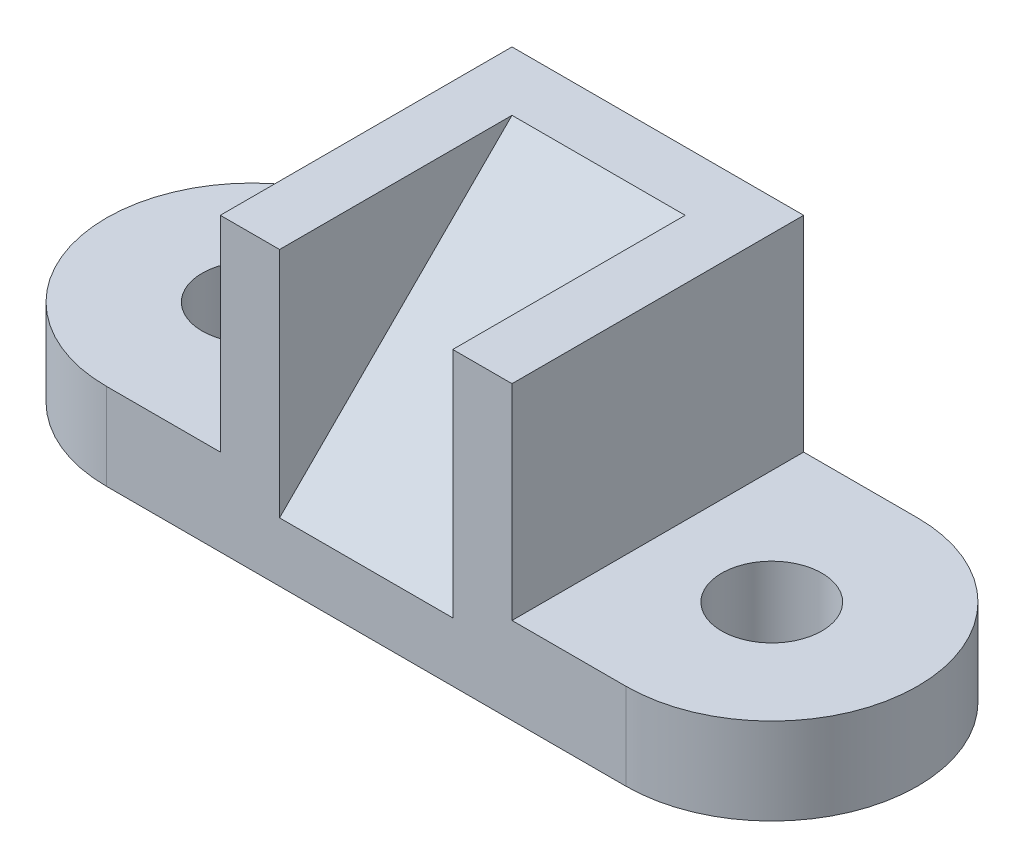
ISO-10303-21;
HEADER;
FILE_DESCRIPTION(('STEP AP214'),'2;1');
FILE_NAME('part.step','',(''),(''),'','','');
FILE_SCHEMA(('AUTOMOTIVE_DESIGN { 1 0 10303 214 1 1 1 1 }'));
ENDSEC;
DATA;
#1=APPLICATION_CONTEXT('core data for automotive mechanical design processes');
#2=APPLICATION_PROTOCOL_DEFINITION('international standard','automotive_design',2000,#1);
#3=PRODUCT_CONTEXT('',#1,'mechanical');
#4=PRODUCT('Part','Part','',(#3));
#5=PRODUCT_RELATED_PRODUCT_CATEGORY('part','',(#4));
#6=PRODUCT_DEFINITION_FORMATION('','',#4);
#7=PRODUCT_DEFINITION_CONTEXT('part definition',#1,'design');
#8=PRODUCT_DEFINITION('design','',#6,#7);
#9=PRODUCT_DEFINITION_SHAPE('','',#8);
#10=(LENGTH_UNIT() NAMED_UNIT(*) SI_UNIT(.MILLI.,.METRE.));
#11=(NAMED_UNIT(*) PLANE_ANGLE_UNIT() SI_UNIT($,.RADIAN.));
#12=(NAMED_UNIT(*) SI_UNIT($,.STERADIAN.) SOLID_ANGLE_UNIT());
#13=UNCERTAINTY_MEASURE_WITH_UNIT(LENGTH_MEASURE(1.E-05),#10,'distance_accuracy_value','');
#14=(GEOMETRIC_REPRESENTATION_CONTEXT(3) GLOBAL_UNCERTAINTY_ASSIGNED_CONTEXT((#13)) GLOBAL_UNIT_ASSIGNED_CONTEXT((#10,
#11,#12)) REPRESENTATION_CONTEXT('',''));
#15=CARTESIAN_POINT('',(0.,0.,0.));
#16=DIRECTION('',(0.,0.,1.));
#17=DIRECTION('',(1.,0.,0.));
#18=AXIS2_PLACEMENT_3D('',#15,#16,#17);
#19=CARTESIAN_POINT('',(0.,19.,0.));
#20=DIRECTION('',(0.,0.,-1.));
#21=DIRECTION('',(-1.,0.,0.));
#22=AXIS2_PLACEMENT_3D('',#19,#20,#21);
#23=PLANE('',#22);
#24=DIRECTION('',(0.,-1.,0.));
#25=VECTOR('',#24,1.);
#26=CARTESIAN_POINT('',(19.,0.,0.));
#27=LINE('',#26,#25);
#28=CARTESIAN_POINT('',(19.,64.,0.));
#29=VERTEX_POINT('',#28);
#30=CARTESIAN_POINT('',(19.,13.,0.));
#31=VERTEX_POINT('',#30);
#32=EDGE_CURVE('E124',#29,#31,#27,.T.);
#33=ORIENTED_EDGE('',*,*,#32,.T.);
#34=DIRECTION('',(1.,0.,0.));
#35=VECTOR('',#34,1.);
#36=CARTESIAN_POINT('',(-19.,13.,0.));
#37=LINE('',#36,#35);
#38=CARTESIAN_POINT('',(-19.,13.,0.));
#39=VERTEX_POINT('',#38);
#40=EDGE_CURVE('E182',#39,#31,#37,.T.);
#41=ORIENTED_EDGE('',*,*,#40,.F.);
#42=DIRECTION('',(0.,-1.,0.));
#43=VECTOR('',#42,1.);
#44=CARTESIAN_POINT('',(-19.,0.,0.));
#45=LINE('',#44,#43);
#46=CARTESIAN_POINT('',(-19.,64.,0.));
#47=VERTEX_POINT('',#46);
#48=EDGE_CURVE('E177',#47,#39,#45,.T.);
#49=ORIENTED_EDGE('',*,*,#48,.F.);
#50=DIRECTION('',(1.,0.,0.));
#51=VECTOR('',#50,1.);
#52=CARTESIAN_POINT('',(0.,64.,0.));
#53=LINE('',#52,#51);
#54=CARTESIAN_POINT('',(-32.,64.,0.));
#55=VERTEX_POINT('',#54);
#56=EDGE_CURVE('E191',#55,#47,#53,.T.);
#57=ORIENTED_EDGE('',*,*,#56,.F.);
#58=DIRECTION('',(0.,-1.,0.));
#59=VECTOR('',#58,1.);
#60=CARTESIAN_POINT('',(-32.,64.,0.));
#61=LINE('',#60,#59);
#62=CARTESIAN_POINT('',(-32.,19.,0.));
#63=VERTEX_POINT('',#62);
#64=EDGE_CURVE('E194',#55,#63,#61,.T.);
#65=ORIENTED_EDGE('',*,*,#64,.T.);
#66=DIRECTION('',(1.,0.,0.));
#67=VECTOR('',#66,1.);
#68=CARTESIAN_POINT('',(0.,19.,0.));
#69=LINE('',#68,#67);
#70=CARTESIAN_POINT('',(-57.,19.,0.));
#71=VERTEX_POINT('',#70);
#72=EDGE_CURVE('E214',#71,#63,#69,.T.);
#73=ORIENTED_EDGE('',*,*,#72,.F.);
#74=DIRECTION('',(0.,-1.,0.));
#75=VECTOR('',#74,1.);
#76=CARTESIAN_POINT('',(-57.,19.,0.));
#77=LINE('',#76,#75);
#78=CARTESIAN_POINT('',(-57.,0.,0.));
#79=VERTEX_POINT('',#78);
#80=EDGE_CURVE('E47',#71,#79,#77,.T.);
#81=ORIENTED_EDGE('',*,*,#80,.T.);
#82=DIRECTION('',(1.,0.,0.));
#83=VECTOR('',#82,1.);
#84=CARTESIAN_POINT('',(0.,0.,0.));
#85=LINE('',#84,#83);
#86=CARTESIAN_POINT('',(57.,0.,0.));
#87=VERTEX_POINT('',#86);
#88=EDGE_CURVE('E212',#79,#87,#85,.T.);
#89=ORIENTED_EDGE('',*,*,#88,.T.);
#90=DIRECTION('',(0.,-1.,0.));
#91=VECTOR('',#90,1.);
#92=CARTESIAN_POINT('',(57.,19.,0.));
#93=LINE('',#92,#91);
#94=CARTESIAN_POINT('',(57.,19.,0.));
#95=VERTEX_POINT('',#94);
#96=EDGE_CURVE('E174',#95,#87,#93,.T.);
#97=ORIENTED_EDGE('',*,*,#96,.F.);
#98=DIRECTION('',(-1.,0.,0.));
#99=VECTOR('',#98,1.);
#100=CARTESIAN_POINT('',(0.,19.,0.));
#101=LINE('',#100,#99);
#102=CARTESIAN_POINT('',(32.,19.,0.));
#103=VERTEX_POINT('',#102);
#104=EDGE_CURVE('E162',#95,#103,#101,.T.);
#105=ORIENTED_EDGE('',*,*,#104,.T.);
#106=DIRECTION('',(0.,-1.,0.));
#107=VECTOR('',#106,1.);
#108=CARTESIAN_POINT('',(32.,64.,0.));
#109=LINE('',#108,#107);
#110=CARTESIAN_POINT('',(32.,64.,0.));
#111=VERTEX_POINT('',#110);
#112=EDGE_CURVE('E144',#111,#103,#109,.T.);
#113=ORIENTED_EDGE('',*,*,#112,.F.);
#114=DIRECTION('',(-1.,0.,0.));
#115=VECTOR('',#114,1.);
#116=CARTESIAN_POINT('',(0.,64.,0.));
#117=LINE('',#116,#115);
#118=EDGE_CURVE('E138',#111,#29,#117,.T.);
#119=ORIENTED_EDGE('',*,*,#118,.T.);
#120=EDGE_LOOP('',(#33,#41,#49,#57,#65,#73,#81,#89,#97,#105,#113,#119));
#121=FACE_BOUND('',#120,.T.);
#122=ADVANCED_FACE('F39',(#121),#23,.F.);
#123=CARTESIAN_POINT('',(0.,64.,0.));
#124=DIRECTION('',(0.,-1.,0.));
#125=DIRECTION('',(0.,0.,-1.));
#126=AXIS2_PLACEMENT_3D('',#123,#124,#125);
#127=PLANE('',#126);
#128=DIRECTION('',(1.,0.,0.));
#129=VECTOR('',#128,1.);
#130=CARTESIAN_POINT('',(-19.,64.,-51.));
#131=LINE('',#130,#129);
#132=CARTESIAN_POINT('',(-19.,64.,-51.));
#133=VERTEX_POINT('',#132);
#134=CARTESIAN_POINT('',(19.,64.,-51.));
#135=VERTEX_POINT('',#134);
#136=EDGE_CURVE('E141',#133,#135,#131,.T.);
#137=ORIENTED_EDGE('',*,*,#136,.T.);
#138=DIRECTION('',(0.,0.,1.));
#139=VECTOR('',#138,1.);
#140=CARTESIAN_POINT('',(19.,64.,0.));
#141=LINE('',#140,#139);
#142=EDGE_CURVE('E127',#135,#29,#141,.T.);
#143=ORIENTED_EDGE('',*,*,#142,.T.);
#144=ORIENTED_EDGE('',*,*,#118,.F.);
#145=DIRECTION('',(0.,0.,1.));
#146=VECTOR('',#145,1.);
#147=CARTESIAN_POINT('',(32.,64.,0.));
#148=LINE('',#147,#146);
#149=CARTESIAN_POINT('',(32.,64.,-64.));
#150=VERTEX_POINT('',#149);
#151=EDGE_CURVE('E145',#150,#111,#148,.T.);
#152=ORIENTED_EDGE('',*,*,#151,.F.);
#153=DIRECTION('',(-1.,0.,0.));
#154=VECTOR('',#153,1.);
#155=CARTESIAN_POINT('',(-32.,64.,-64.));
#156=LINE('',#155,#154);
#157=CARTESIAN_POINT('',(-32.,64.,-64.));
#158=VERTEX_POINT('',#157);
#159=EDGE_CURVE('E186',#150,#158,#156,.T.);
#160=ORIENTED_EDGE('',*,*,#159,.T.);
#161=DIRECTION('',(0.,0.,1.));
#162=VECTOR('',#161,1.);
#163=CARTESIAN_POINT('',(-32.,64.,0.));
#164=LINE('',#163,#162);
#165=EDGE_CURVE('E189',#158,#55,#164,.T.);
#166=ORIENTED_EDGE('',*,*,#165,.T.);
#167=ORIENTED_EDGE('',*,*,#56,.T.);
#168=DIRECTION('',(0.,0.,1.));
#169=VECTOR('',#168,1.);
#170=CARTESIAN_POINT('',(-19.,64.,0.));
#171=LINE('',#170,#169);
#172=EDGE_CURVE('E180',#133,#47,#171,.T.);
#173=ORIENTED_EDGE('',*,*,#172,.F.);
#174=EDGE_LOOP('',(#137,#143,#144,#152,#160,#166,#167,#173));
#175=FACE_BOUND('',#174,.T.);
#176=ADVANCED_FACE('F136',(#175),#127,.F.);
#177=CARTESIAN_POINT('',(-57.,19.,-32.));
#178=DIRECTION('',(0.,1.,0.));
#179=DIRECTION('',(0.,0.,1.));
#180=AXIS2_PLACEMENT_3D('',#177,#178,#179);
#181=PLANE('',#180);
#182=DIRECTION('',(0.,0.,1.));
#183=VECTOR('',#182,1.);
#184=CARTESIAN_POINT('',(-32.,19.,0.));
#185=LINE('',#184,#183);
#186=CARTESIAN_POINT('',(-32.,19.,-64.));
#187=VERTEX_POINT('',#186);
#188=EDGE_CURVE('E184',#187,#63,#185,.T.);
#189=ORIENTED_EDGE('',*,*,#188,.F.);
#190=DIRECTION('',(-1.,0.,0.));
#191=VECTOR('',#190,1.);
#192=CARTESIAN_POINT('',(-57.,19.,-64.));
#193=LINE('',#192,#191);
#194=CARTESIAN_POINT('',(-57.,19.,-64.));
#195=VERTEX_POINT('',#194);
#196=EDGE_CURVE('E209',#187,#195,#193,.T.);
#197=ORIENTED_EDGE('',*,*,#196,.T.);
#198=CARTESIAN_POINT('',(-57.,19.,-32.));
#199=DIRECTION('',(0.,1.,0.));
#200=DIRECTION('',(0.,0.,1.));
#201=AXIS2_PLACEMENT_3D('',#198,#199,#200);
#202=CIRCLE('',#201,32.);
#203=EDGE_CURVE('E211',#195,#71,#202,.T.);
#204=ORIENTED_EDGE('',*,*,#203,.T.);
#205=ORIENTED_EDGE('',*,*,#72,.T.);
#206=EDGE_LOOP('',(#189,#197,#204,#205));
#207=FACE_BOUND('',#206,.T.);
#208=CARTESIAN_POINT('',(-57.,19.,-32.));
#209=DIRECTION('',(0.,1.,0.));
#210=DIRECTION('',(0.,0.,1.));
#211=AXIS2_PLACEMENT_3D('',#208,#209,#210);
#212=CIRCLE('',#211,11.);
#213=CARTESIAN_POINT('',(-57.,19.,-21.));
#214=VERTEX_POINT('',#213);
#215=EDGE_CURVE('E203',#214,#214,#212,.T.);
#216=ORIENTED_EDGE('',*,*,#215,.F.);
#217=EDGE_LOOP('',(#216));
#218=FACE_BOUND('',#217,.T.);
#219=ADVANCED_FACE('F266',(#207,#218),#181,.T.);
#220=CARTESIAN_POINT('',(-57.,0.,-32.));
#221=DIRECTION('',(0.,1.,0.));
#222=DIRECTION('',(0.,0.,1.));
#223=AXIS2_PLACEMENT_3D('',#220,#221,#222);
#224=PLANE('',#223);
#225=DIRECTION('',(-1.,0.,0.));
#226=VECTOR('',#225,1.);
#227=CARTESIAN_POINT('',(-57.,0.,-64.));
#228=LINE('',#227,#226);
#229=CARTESIAN_POINT('',(57.,0.,-64.));
#230=VERTEX_POINT('',#229);
#231=CARTESIAN_POINT('',(-57.,0.,-64.));
#232=VERTEX_POINT('',#231);
#233=EDGE_CURVE('E206',#230,#232,#228,.T.);
#234=ORIENTED_EDGE('',*,*,#233,.F.);
#235=CARTESIAN_POINT('',(57.,0.,-32.));
#236=DIRECTION('',(0.,-1.,0.));
#237=DIRECTION('',(0.,0.,1.));
#238=AXIS2_PLACEMENT_3D('',#235,#236,#237);
#239=CIRCLE('',#238,32.);
#240=EDGE_CURVE('E159',#230,#87,#239,.T.);
#241=ORIENTED_EDGE('',*,*,#240,.T.);
#242=ORIENTED_EDGE('',*,*,#88,.F.);
#243=CARTESIAN_POINT('',(-57.,0.,-32.));
#244=DIRECTION('',(0.,1.,0.));
#245=DIRECTION('',(0.,0.,1.));
#246=AXIS2_PLACEMENT_3D('',#243,#244,#245);
#247=CIRCLE('',#246,32.);
#248=EDGE_CURVE('E217',#232,#79,#247,.T.);
#249=ORIENTED_EDGE('',*,*,#248,.F.);
#250=EDGE_LOOP('',(#234,#241,#242,#249));
#251=FACE_BOUND('',#250,.T.);
#252=CARTESIAN_POINT('',(-57.,0.,-32.));
#253=DIRECTION('',(0.,1.,0.));
#254=DIRECTION('',(0.,0.,1.));
#255=AXIS2_PLACEMENT_3D('',#252,#253,#254);
#256=CIRCLE('',#255,11.);
#257=CARTESIAN_POINT('',(-57.,0.,-21.));
#258=VERTEX_POINT('',#257);
#259=EDGE_CURVE('E202',#258,#258,#256,.T.);
#260=ORIENTED_EDGE('',*,*,#259,.T.);
#261=EDGE_LOOP('',(#260));
#262=FACE_BOUND('',#261,.T.);
#263=CARTESIAN_POINT('',(57.,0.,-32.));
#264=DIRECTION('',(0.,-1.,0.));
#265=DIRECTION('',(0.,0.,1.));
#266=AXIS2_PLACEMENT_3D('',#263,#264,#265);
#267=CIRCLE('',#266,11.);
#268=CARTESIAN_POINT('',(57.,0.,-21.));
#269=VERTEX_POINT('',#268);
#270=EDGE_CURVE('E155',#269,#269,#267,.T.);
#271=ORIENTED_EDGE('',*,*,#270,.F.);
#272=EDGE_LOOP('',(#271));
#273=FACE_BOUND('',#272,.T.);
#274=ADVANCED_FACE('F227',(#251,#262,#273),#224,.F.);
#275=CARTESIAN_POINT('',(-57.,19.,-64.));
#276=DIRECTION('',(0.,0.,1.));
#277=DIRECTION('',(1.,0.,0.));
#278=AXIS2_PLACEMENT_3D('',#275,#276,#277);
#279=PLANE('',#278);
#280=ORIENTED_EDGE('',*,*,#233,.T.);
#281=DIRECTION('',(0.,-1.,0.));
#282=VECTOR('',#281,1.);
#283=CARTESIAN_POINT('',(-57.,19.,-64.));
#284=LINE('',#283,#282);
#285=EDGE_CURVE('E11',#195,#232,#284,.T.);
#286=ORIENTED_EDGE('',*,*,#285,.F.);
#287=ORIENTED_EDGE('',*,*,#196,.F.);
#288=DIRECTION('',(0.,-1.,0.));
#289=VECTOR('',#288,1.);
#290=CARTESIAN_POINT('',(-32.,64.,-64.));
#291=LINE('',#290,#289);
#292=EDGE_CURVE('E199',#158,#187,#291,.T.);
#293=ORIENTED_EDGE('',*,*,#292,.F.);
#294=ORIENTED_EDGE('',*,*,#159,.F.);
#295=DIRECTION('',(0.,-1.,0.));
#296=VECTOR('',#295,1.);
#297=CARTESIAN_POINT('',(32.,64.,-64.));
#298=LINE('',#297,#296);
#299=CARTESIAN_POINT('',(32.,19.,-64.));
#300=VERTEX_POINT('',#299);
#301=EDGE_CURVE('E147',#150,#300,#298,.T.);
#302=ORIENTED_EDGE('',*,*,#301,.T.);
#303=DIRECTION('',(1.,0.,0.));
#304=VECTOR('',#303,1.);
#305=CARTESIAN_POINT('',(57.,19.,-64.));
#306=LINE('',#305,#304);
#307=CARTESIAN_POINT('',(57.,19.,-64.));
#308=VERTEX_POINT('',#307);
#309=EDGE_CURVE('E167',#300,#308,#306,.T.);
#310=ORIENTED_EDGE('',*,*,#309,.T.);
#311=DIRECTION('',(0.,-1.,0.));
#312=VECTOR('',#311,1.);
#313=CARTESIAN_POINT('',(57.,19.,-64.));
#314=LINE('',#313,#312);
#315=EDGE_CURVE('E169',#308,#230,#314,.T.);
#316=ORIENTED_EDGE('',*,*,#315,.T.);
#317=EDGE_LOOP('',(#280,#286,#287,#293,#294,#302,#310,#316));
#318=FACE_BOUND('',#317,.T.);
#319=ADVANCED_FACE('F41',(#318),#279,.F.);
#320=CARTESIAN_POINT('',(-57.,19.,-32.));
#321=DIRECTION('',(0.,-1.,0.));
#322=DIRECTION('',(0.,0.,-1.));
#323=AXIS2_PLACEMENT_3D('',#320,#321,#322);
#324=CYLINDRICAL_SURFACE('',#323,32.);
#325=ORIENTED_EDGE('',*,*,#248,.T.);
#326=ORIENTED_EDGE('',*,*,#80,.F.);
#327=ORIENTED_EDGE('',*,*,#203,.F.);
#328=ORIENTED_EDGE('',*,*,#285,.T.);
#329=EDGE_LOOP('',(#325,#326,#327,#328));
#330=FACE_BOUND('',#329,.T.);
#331=ADVANCED_FACE('F269',(#330),#324,.T.);
#332=CARTESIAN_POINT('',(-57.,19.,-32.));
#333=DIRECTION('',(0.,-1.,0.));
#334=DIRECTION('',(0.,0.,-1.));
#335=AXIS2_PLACEMENT_3D('',#332,#333,#334);
#336=CYLINDRICAL_SURFACE('',#335,11.);
#337=ORIENTED_EDGE('',*,*,#215,.T.);
#338=EDGE_LOOP('',(#337));
#339=FACE_BOUND('',#338,.T.);
#340=ORIENTED_EDGE('',*,*,#259,.F.);
#341=EDGE_LOOP('',(#340));
#342=FACE_BOUND('',#341,.T.);
#343=ADVANCED_FACE('F258',(#339,#342),#336,.F.);
#344=CARTESIAN_POINT('',(-32.,64.,0.));
#345=DIRECTION('',(1.,0.,0.));
#346=DIRECTION('',(0.,0.,-1.));
#347=AXIS2_PLACEMENT_3D('',#344,#345,#346);
#348=PLANE('',#347);
#349=ORIENTED_EDGE('',*,*,#188,.T.);
#350=ORIENTED_EDGE('',*,*,#64,.F.);
#351=ORIENTED_EDGE('',*,*,#165,.F.);
#352=ORIENTED_EDGE('',*,*,#292,.T.);
#353=EDGE_LOOP('',(#349,#350,#351,#352));
#354=FACE_BOUND('',#353,.T.);
#355=ADVANCED_FACE('F245',(#354),#348,.F.);
#356=CARTESIAN_POINT('',(-19.,6.5,6.5));
#357=DIRECTION('',(0.,-0.707106781186548,-0.707106781186548));
#358=DIRECTION('',(0.,0.707106781186548,-0.707106781186548));
#359=AXIS2_PLACEMENT_3D('',#356,#357,#358);
#360=PLANE('',#359);
#361=ORIENTED_EDGE('',*,*,#40,.T.);
#362=DIRECTION('',(0.,0.707106781186548,-0.707106781186548));
#363=VECTOR('',#362,1.);
#364=CARTESIAN_POINT('',(19.,6.5,6.5));
#365=LINE('',#364,#363);
#366=EDGE_CURVE('E129',#31,#135,#365,.T.);
#367=ORIENTED_EDGE('',*,*,#366,.T.);
#368=ORIENTED_EDGE('',*,*,#136,.F.);
#369=DIRECTION('',(0.,0.707106781186548,-0.707106781186548));
#370=VECTOR('',#369,1.);
#371=CARTESIAN_POINT('',(-19.,6.5,6.5));
#372=LINE('',#371,#370);
#373=EDGE_CURVE('E62',#39,#133,#372,.T.);
#374=ORIENTED_EDGE('',*,*,#373,.F.);
#375=EDGE_LOOP('',(#361,#367,#368,#374));
#376=FACE_BOUND('',#375,.T.);
#377=ADVANCED_FACE('F250',(#376),#360,.F.);
#378=CARTESIAN_POINT('',(-19.,0.,0.));
#379=DIRECTION('',(1.,0.,0.));
#380=DIRECTION('',(0.,0.,-1.));
#381=AXIS2_PLACEMENT_3D('',#378,#379,#380);
#382=PLANE('',#381);
#383=ORIENTED_EDGE('',*,*,#48,.T.);
#384=ORIENTED_EDGE('',*,*,#373,.T.);
#385=ORIENTED_EDGE('',*,*,#172,.T.);
#386=EDGE_LOOP('',(#383,#384,#385));
#387=FACE_BOUND('',#386,.T.);
#388=ADVANCED_FACE('F248',(#387),#382,.T.);
#389=CARTESIAN_POINT('',(57.,19.,-32.));
#390=DIRECTION('',(0.,-1.,0.));
#391=DIRECTION('',(0.,0.,-1.));
#392=AXIS2_PLACEMENT_3D('',#389,#390,#391);
#393=CYLINDRICAL_SURFACE('',#392,32.);
#394=ORIENTED_EDGE('',*,*,#240,.F.);
#395=ORIENTED_EDGE('',*,*,#315,.F.);
#396=CARTESIAN_POINT('',(57.,19.,-32.));
#397=DIRECTION('',(0.,-1.,0.));
#398=DIRECTION('',(0.,0.,1.));
#399=AXIS2_PLACEMENT_3D('',#396,#397,#398);
#400=CIRCLE('',#399,32.);
#401=EDGE_CURVE('E164',#308,#95,#400,.T.);
#402=ORIENTED_EDGE('',*,*,#401,.T.);
#403=ORIENTED_EDGE('',*,*,#96,.T.);
#404=EDGE_LOOP('',(#394,#395,#402,#403));
#405=FACE_BOUND('',#404,.T.);
#406=ADVANCED_FACE('F232',(#405),#393,.T.);
#407=CARTESIAN_POINT('',(57.,19.,-32.));
#408=DIRECTION('',(0.,1.,0.));
#409=DIRECTION('',(0.,0.,1.));
#410=AXIS2_PLACEMENT_3D('',#407,#408,#409);
#411=PLANE('',#410);
#412=DIRECTION('',(0.,0.,1.));
#413=VECTOR('',#412,1.);
#414=CARTESIAN_POINT('',(32.,19.,0.));
#415=LINE('',#414,#413);
#416=EDGE_CURVE('E54',#300,#103,#415,.T.);
#417=ORIENTED_EDGE('',*,*,#416,.T.);
#418=ORIENTED_EDGE('',*,*,#104,.F.);
#419=ORIENTED_EDGE('',*,*,#401,.F.);
#420=ORIENTED_EDGE('',*,*,#309,.F.);
#421=EDGE_LOOP('',(#417,#418,#419,#420));
#422=FACE_BOUND('',#421,.T.);
#423=CARTESIAN_POINT('',(57.,19.,-32.));
#424=DIRECTION('',(0.,-1.,0.));
#425=DIRECTION('',(0.,0.,1.));
#426=AXIS2_PLACEMENT_3D('',#423,#424,#425);
#427=CIRCLE('',#426,11.);
#428=CARTESIAN_POINT('',(57.,19.,-21.));
#429=VERTEX_POINT('',#428);
#430=EDGE_CURVE('E156',#429,#429,#427,.T.);
#431=ORIENTED_EDGE('',*,*,#430,.T.);
#432=EDGE_LOOP('',(#431));
#433=FACE_BOUND('',#432,.T.);
#434=ADVANCED_FACE('F234',(#422,#433),#411,.T.);
#435=CARTESIAN_POINT('',(57.,19.,-32.));
#436=DIRECTION('',(0.,-1.,0.));
#437=DIRECTION('',(0.,0.,-1.));
#438=AXIS2_PLACEMENT_3D('',#435,#436,#437);
#439=CYLINDRICAL_SURFACE('',#438,11.);
#440=ORIENTED_EDGE('',*,*,#430,.F.);
#441=EDGE_LOOP('',(#440));
#442=FACE_BOUND('',#441,.T.);
#443=ORIENTED_EDGE('',*,*,#270,.T.);
#444=EDGE_LOOP('',(#443));
#445=FACE_BOUND('',#444,.T.);
#446=ADVANCED_FACE('F287',(#442,#445),#439,.F.);
#447=CARTESIAN_POINT('',(32.,64.,0.));
#448=DIRECTION('',(1.,0.,0.));
#449=DIRECTION('',(0.,0.,-1.));
#450=AXIS2_PLACEMENT_3D('',#447,#448,#449);
#451=PLANE('',#450);
#452=ORIENTED_EDGE('',*,*,#416,.F.);
#453=ORIENTED_EDGE('',*,*,#301,.F.);
#454=ORIENTED_EDGE('',*,*,#151,.T.);
#455=ORIENTED_EDGE('',*,*,#112,.T.);
#456=EDGE_LOOP('',(#452,#453,#454,#455));
#457=FACE_BOUND('',#456,.T.);
#458=ADVANCED_FACE('F240',(#457),#451,.T.);
#459=CARTESIAN_POINT('',(19.,0.,0.));
#460=DIRECTION('',(-1.,0.,0.));
#461=DIRECTION('',(0.,0.,-1.));
#462=AXIS2_PLACEMENT_3D('',#459,#460,#461);
#463=PLANE('',#462);
#464=ORIENTED_EDGE('',*,*,#32,.F.);
#465=ORIENTED_EDGE('',*,*,#142,.F.);
#466=ORIENTED_EDGE('',*,*,#366,.F.);
#467=EDGE_LOOP('',(#464,#465,#466));
#468=FACE_BOUND('',#467,.T.);
#469=ADVANCED_FACE('F126',(#468),#463,.T.);
#470=CLOSED_SHELL('',(#122,#176,#219,#274,#319,#331,#343,#355,#377,#388,#406,#434,#446,#458,#469));
#471=MANIFOLD_SOLID_BREP('B2',#470);
#472=ADVANCED_BREP_SHAPE_REPRESENTATION('',(#18,#471),#14);
#473=SHAPE_DEFINITION_REPRESENTATION(#9,#472);
ENDSEC;
END-ISO-10303-21;
